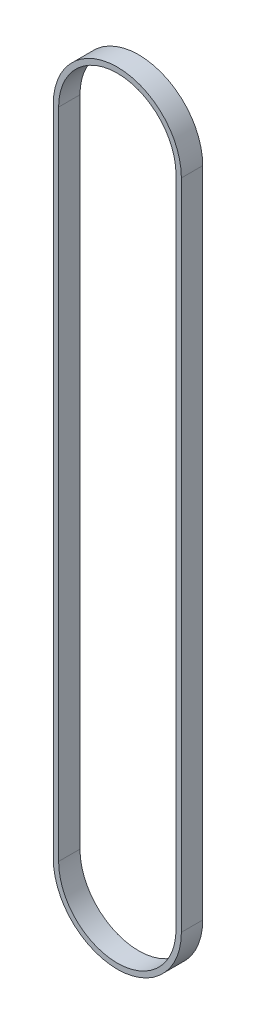
ISO-10303-21;
HEADER;
FILE_DESCRIPTION(('STEP AP214'),'2;1');
FILE_NAME('part.step','',(''),(''),'','','');
FILE_SCHEMA(('AUTOMOTIVE_DESIGN { 1 0 10303 214 1 1 1 1 }'));
ENDSEC;
DATA;
#1=APPLICATION_CONTEXT('core data for automotive mechanical design processes');
#2=APPLICATION_PROTOCOL_DEFINITION('international standard','automotive_design',2000,#1);
#3=PRODUCT_CONTEXT('',#1,'mechanical');
#4=PRODUCT('Part','Part','',(#3));
#5=PRODUCT_RELATED_PRODUCT_CATEGORY('part','',(#4));
#6=PRODUCT_DEFINITION_FORMATION('','',#4);
#7=PRODUCT_DEFINITION_CONTEXT('part definition',#1,'design');
#8=PRODUCT_DEFINITION('design','',#6,#7);
#9=PRODUCT_DEFINITION_SHAPE('','',#8);
#10=(LENGTH_UNIT() NAMED_UNIT(*) SI_UNIT(.MILLI.,.METRE.));
#11=(NAMED_UNIT(*) PLANE_ANGLE_UNIT() SI_UNIT($,.RADIAN.));
#12=(NAMED_UNIT(*) SI_UNIT($,.STERADIAN.) SOLID_ANGLE_UNIT());
#13=UNCERTAINTY_MEASURE_WITH_UNIT(LENGTH_MEASURE(1.E-05),#10,'distance_accuracy_value','');
#14=(GEOMETRIC_REPRESENTATION_CONTEXT(3) GLOBAL_UNCERTAINTY_ASSIGNED_CONTEXT((#13)) GLOBAL_UNIT_ASSIGNED_CONTEXT((#10,
#11,#12)) REPRESENTATION_CONTEXT('',''));
#15=CARTESIAN_POINT('',(0.,0.,0.));
#16=DIRECTION('',(0.,0.,1.));
#17=DIRECTION('',(1.,0.,0.));
#18=AXIS2_PLACEMENT_3D('',#15,#16,#17);
#19=CARTESIAN_POINT('',(0.,410.750708602889,25.4));
#20=DIRECTION('',(0.,0.,1.));
#21=DIRECTION('',(1.,0.,0.));
#22=AXIS2_PLACEMENT_3D('',#19,#20,#21);
#23=PLANE('',#22);
#24=CARTESIAN_POINT('',(0.,410.750708602889,25.4));
#25=DIRECTION('',(0.,0.,1.));
#26=DIRECTION('',(1.,0.,0.));
#27=AXIS2_PLACEMENT_3D('',#24,#25,#26);
#28=CIRCLE('',#27,76.2);
#29=CARTESIAN_POINT('',(76.2,410.750708602889,25.4));
#30=VERTEX_POINT('',#29);
#31=CARTESIAN_POINT('',(-76.2,410.750708602889,25.4));
#32=VERTEX_POINT('',#31);
#33=EDGE_CURVE('E139',#30,#32,#28,.T.);
#34=ORIENTED_EDGE('',*,*,#33,.T.);
#35=DIRECTION('',(0.,-1.,0.));
#36=VECTOR('',#35,1.);
#37=CARTESIAN_POINT('',(-76.2,-366.489291397111,25.4));
#38=LINE('',#37,#36);
#39=CARTESIAN_POINT('',(-76.2,-366.489291397111,25.4));
#40=VERTEX_POINT('',#39);
#41=EDGE_CURVE('E142',#32,#40,#38,.T.);
#42=ORIENTED_EDGE('',*,*,#41,.T.);
#43=CARTESIAN_POINT('',(0.,-366.489291397111,25.4));
#44=DIRECTION('',(0.,0.,1.));
#45=DIRECTION('',(1.,0.,0.));
#46=AXIS2_PLACEMENT_3D('',#43,#44,#45);
#47=CIRCLE('',#46,76.2);
#48=CARTESIAN_POINT('',(76.2,-366.489291397111,25.4));
#49=VERTEX_POINT('',#48);
#50=EDGE_CURVE('E145',#40,#49,#47,.T.);
#51=ORIENTED_EDGE('',*,*,#50,.T.);
#52=DIRECTION('',(0.,1.,0.));
#53=VECTOR('',#52,1.);
#54=CARTESIAN_POINT('',(76.2,-366.489291397111,25.4));
#55=LINE('',#54,#53);
#56=EDGE_CURVE('E147',#49,#30,#55,.T.);
#57=ORIENTED_EDGE('',*,*,#56,.T.);
#58=EDGE_LOOP('',(#34,#42,#51,#57));
#59=FACE_BOUND('',#58,.T.);
#60=DIRECTION('',(0.,-1.,0.));
#61=VECTOR('',#60,1.);
#62=CARTESIAN_POINT('',(-69.85,410.750708602889,25.4));
#63=LINE('',#62,#61);
#64=CARTESIAN_POINT('',(-69.85,410.750708602889,25.4));
#65=VERTEX_POINT('',#64);
#66=CARTESIAN_POINT('',(-69.85,-366.489291397111,25.4));
#67=VERTEX_POINT('',#66);
#68=EDGE_CURVE('E111',#65,#67,#63,.T.);
#69=ORIENTED_EDGE('',*,*,#68,.F.);
#70=CARTESIAN_POINT('',(0.,410.750708602889,25.4));
#71=DIRECTION('',(0.,0.,1.));
#72=DIRECTION('',(1.,0.,0.));
#73=AXIS2_PLACEMENT_3D('',#70,#71,#72);
#74=CIRCLE('',#73,69.85);
#75=CARTESIAN_POINT('',(69.85,410.750708602889,25.4));
#76=VERTEX_POINT('',#75);
#77=EDGE_CURVE('E103',#76,#65,#74,.T.);
#78=ORIENTED_EDGE('',*,*,#77,.F.);
#79=DIRECTION('',(0.,1.,0.));
#80=VECTOR('',#79,1.);
#81=CARTESIAN_POINT('',(69.85,-366.489291397111,25.4));
#82=LINE('',#81,#80);
#83=CARTESIAN_POINT('',(69.85,-366.489291397111,25.4));
#84=VERTEX_POINT('',#83);
#85=EDGE_CURVE('E125',#84,#76,#82,.T.);
#86=ORIENTED_EDGE('',*,*,#85,.F.);
#87=CARTESIAN_POINT('',(0.,-366.489291397111,25.4));
#88=DIRECTION('',(0.,0.,1.));
#89=DIRECTION('',(-1.,0.,0.));
#90=AXIS2_PLACEMENT_3D('',#87,#88,#89);
#91=CIRCLE('',#90,69.85);
#92=EDGE_CURVE('E123',#67,#84,#91,.T.);
#93=ORIENTED_EDGE('',*,*,#92,.F.);
#94=EDGE_LOOP('',(#69,#78,#86,#93));
#95=FACE_BOUND('',#94,.T.);
#96=ADVANCED_FACE('F38',(#59,#95),#23,.T.);
#97=CARTESIAN_POINT('',(0.,410.750708602889,0.));
#98=DIRECTION('',(0.,0.,1.));
#99=DIRECTION('',(1.,0.,0.));
#100=AXIS2_PLACEMENT_3D('',#97,#98,#99);
#101=PLANE('',#100);
#102=CARTESIAN_POINT('',(0.,410.750708602889,0.));
#103=DIRECTION('',(0.,0.,1.));
#104=DIRECTION('',(1.,0.,0.));
#105=AXIS2_PLACEMENT_3D('',#102,#103,#104);
#106=CIRCLE('',#105,76.2);
#107=CARTESIAN_POINT('',(76.2,410.750708602889,0.));
#108=VERTEX_POINT('',#107);
#109=CARTESIAN_POINT('',(-76.2,410.750708602889,0.));
#110=VERTEX_POINT('',#109);
#111=EDGE_CURVE('E119',#108,#110,#106,.T.);
#112=ORIENTED_EDGE('',*,*,#111,.F.);
#113=DIRECTION('',(0.,1.,0.));
#114=VECTOR('',#113,1.);
#115=CARTESIAN_POINT('',(76.2,-366.489291397111,0.));
#116=LINE('',#115,#114);
#117=CARTESIAN_POINT('',(76.2,-366.489291397111,0.));
#118=VERTEX_POINT('',#117);
#119=EDGE_CURVE('E143',#118,#108,#116,.T.);
#120=ORIENTED_EDGE('',*,*,#119,.F.);
#121=CARTESIAN_POINT('',(0.,-366.489291397111,0.));
#122=DIRECTION('',(0.,0.,1.));
#123=DIRECTION('',(1.,0.,0.));
#124=AXIS2_PLACEMENT_3D('',#121,#122,#123);
#125=CIRCLE('',#124,76.2);
#126=CARTESIAN_POINT('',(-76.2,-366.489291397111,0.));
#127=VERTEX_POINT('',#126);
#128=EDGE_CURVE('E154',#127,#118,#125,.T.);
#129=ORIENTED_EDGE('',*,*,#128,.F.);
#130=DIRECTION('',(0.,-1.,0.));
#131=VECTOR('',#130,1.);
#132=CARTESIAN_POINT('',(-76.2,-366.489291397111,0.));
#133=LINE('',#132,#131);
#134=EDGE_CURVE('E152',#110,#127,#133,.T.);
#135=ORIENTED_EDGE('',*,*,#134,.F.);
#136=EDGE_LOOP('',(#112,#120,#129,#135));
#137=FACE_BOUND('',#136,.T.);
#138=CARTESIAN_POINT('',(0.,410.750708602889,0.));
#139=DIRECTION('',(0.,0.,1.));
#140=DIRECTION('',(1.,0.,0.));
#141=AXIS2_PLACEMENT_3D('',#138,#139,#140);
#142=CIRCLE('',#141,69.85);
#143=CARTESIAN_POINT('',(69.85,410.750708602889,0.));
#144=VERTEX_POINT('',#143);
#145=CARTESIAN_POINT('',(-69.85,410.750708602889,0.));
#146=VERTEX_POINT('',#145);
#147=EDGE_CURVE('E61',#144,#146,#142,.T.);
#148=ORIENTED_EDGE('',*,*,#147,.T.);
#149=DIRECTION('',(0.,-1.,0.));
#150=VECTOR('',#149,1.);
#151=CARTESIAN_POINT('',(-69.85,410.750708602889,0.));
#152=LINE('',#151,#150);
#153=CARTESIAN_POINT('',(-69.85,-366.489291397111,0.));
#154=VERTEX_POINT('',#153);
#155=EDGE_CURVE('E118',#146,#154,#152,.T.);
#156=ORIENTED_EDGE('',*,*,#155,.T.);
#157=CARTESIAN_POINT('',(0.,-366.489291397111,0.));
#158=DIRECTION('',(0.,0.,1.));
#159=DIRECTION('',(-1.,0.,0.));
#160=AXIS2_PLACEMENT_3D('',#157,#158,#159);
#161=CIRCLE('',#160,69.85);
#162=CARTESIAN_POINT('',(69.85,-366.489291397111,0.));
#163=VERTEX_POINT('',#162);
#164=EDGE_CURVE('E131',#154,#163,#161,.T.);
#165=ORIENTED_EDGE('',*,*,#164,.T.);
#166=DIRECTION('',(0.,1.,0.));
#167=VECTOR('',#166,1.);
#168=CARTESIAN_POINT('',(69.85,-366.489291397111,0.));
#169=LINE('',#168,#167);
#170=EDGE_CURVE('E112',#163,#144,#169,.T.);
#171=ORIENTED_EDGE('',*,*,#170,.T.);
#172=EDGE_LOOP('',(#148,#156,#165,#171));
#173=FACE_BOUND('',#172,.T.);
#174=ADVANCED_FACE('F172',(#137,#173),#101,.F.);
#175=CARTESIAN_POINT('',(0.,410.750708602889,25.4));
#176=DIRECTION('',(0.,0.,-1.));
#177=DIRECTION('',(-1.,0.,0.));
#178=AXIS2_PLACEMENT_3D('',#175,#176,#177);
#179=CYLINDRICAL_SURFACE('',#178,76.2);
#180=ORIENTED_EDGE('',*,*,#111,.T.);
#181=DIRECTION('',(0.,0.,-1.));
#182=VECTOR('',#181,1.);
#183=CARTESIAN_POINT('',(-76.2,410.750708602889,25.4));
#184=LINE('',#183,#182);
#185=EDGE_CURVE('E11',#32,#110,#184,.T.);
#186=ORIENTED_EDGE('',*,*,#185,.F.);
#187=ORIENTED_EDGE('',*,*,#33,.F.);
#188=DIRECTION('',(0.,0.,-1.));
#189=VECTOR('',#188,1.);
#190=CARTESIAN_POINT('',(76.2,410.750708602889,25.4));
#191=LINE('',#190,#189);
#192=EDGE_CURVE('E149',#30,#108,#191,.T.);
#193=ORIENTED_EDGE('',*,*,#192,.T.);
#194=EDGE_LOOP('',(#180,#186,#187,#193));
#195=FACE_BOUND('',#194,.T.);
#196=ADVANCED_FACE('F40',(#195),#179,.T.);
#197=CARTESIAN_POINT('',(-76.2,-366.489291397111,25.4));
#198=DIRECTION('',(1.,0.,0.));
#199=DIRECTION('',(0.,0.,-1.));
#200=AXIS2_PLACEMENT_3D('',#197,#198,#199);
#201=PLANE('',#200);
#202=ORIENTED_EDGE('',*,*,#134,.T.);
#203=DIRECTION('',(0.,0.,-1.));
#204=VECTOR('',#203,1.);
#205=CARTESIAN_POINT('',(-76.2,-366.489291397111,25.4));
#206=LINE('',#205,#204);
#207=EDGE_CURVE('E46',#40,#127,#206,.T.);
#208=ORIENTED_EDGE('',*,*,#207,.F.);
#209=ORIENTED_EDGE('',*,*,#41,.F.);
#210=ORIENTED_EDGE('',*,*,#185,.T.);
#211=EDGE_LOOP('',(#202,#208,#209,#210));
#212=FACE_BOUND('',#211,.T.);
#213=ADVANCED_FACE('F182',(#212),#201,.F.);
#214=CARTESIAN_POINT('',(0.,-366.489291397111,25.4));
#215=DIRECTION('',(0.,0.,-1.));
#216=DIRECTION('',(-1.,0.,0.));
#217=AXIS2_PLACEMENT_3D('',#214,#215,#216);
#218=CYLINDRICAL_SURFACE('',#217,76.2);
#219=ORIENTED_EDGE('',*,*,#128,.T.);
#220=DIRECTION('',(0.,0.,-1.));
#221=VECTOR('',#220,1.);
#222=CARTESIAN_POINT('',(76.2,-366.489291397111,25.4));
#223=LINE('',#222,#221);
#224=EDGE_CURVE('E159',#49,#118,#223,.T.);
#225=ORIENTED_EDGE('',*,*,#224,.F.);
#226=ORIENTED_EDGE('',*,*,#50,.F.);
#227=ORIENTED_EDGE('',*,*,#207,.T.);
#228=EDGE_LOOP('',(#219,#225,#226,#227));
#229=FACE_BOUND('',#228,.T.);
#230=ADVANCED_FACE('F166',(#229),#218,.T.);
#231=CARTESIAN_POINT('',(76.2,-366.489291397111,25.4));
#232=DIRECTION('',(-1.,0.,0.));
#233=DIRECTION('',(0.,-1.,0.));
#234=AXIS2_PLACEMENT_3D('',#231,#232,#233);
#235=PLANE('',#234);
#236=ORIENTED_EDGE('',*,*,#119,.T.);
#237=ORIENTED_EDGE('',*,*,#192,.F.);
#238=ORIENTED_EDGE('',*,*,#56,.F.);
#239=ORIENTED_EDGE('',*,*,#224,.T.);
#240=EDGE_LOOP('',(#236,#237,#238,#239));
#241=FACE_BOUND('',#240,.T.);
#242=ADVANCED_FACE('F176',(#241),#235,.F.);
#243=CARTESIAN_POINT('',(0.,410.750708602889,25.4));
#244=DIRECTION('',(0.,0.,-1.));
#245=DIRECTION('',(-1.,0.,0.));
#246=AXIS2_PLACEMENT_3D('',#243,#244,#245);
#247=CYLINDRICAL_SURFACE('',#246,69.85);
#248=ORIENTED_EDGE('',*,*,#147,.F.);
#249=DIRECTION('',(0.,0.,-1.));
#250=VECTOR('',#249,1.);
#251=CARTESIAN_POINT('',(69.85,410.750708602889,25.4));
#252=LINE('',#251,#250);
#253=EDGE_CURVE('E107',#76,#144,#252,.T.);
#254=ORIENTED_EDGE('',*,*,#253,.F.);
#255=ORIENTED_EDGE('',*,*,#77,.T.);
#256=DIRECTION('',(0.,0.,-1.));
#257=VECTOR('',#256,1.);
#258=CARTESIAN_POINT('',(-69.85,410.750708602889,25.4));
#259=LINE('',#258,#257);
#260=EDGE_CURVE('E106',#65,#146,#259,.T.);
#261=ORIENTED_EDGE('',*,*,#260,.T.);
#262=EDGE_LOOP('',(#248,#254,#255,#261));
#263=FACE_BOUND('',#262,.T.);
#264=ADVANCED_FACE('F105',(#263),#247,.F.);
#265=CARTESIAN_POINT('',(-69.85,410.750708602889,25.4));
#266=DIRECTION('',(1.,0.,0.));
#267=DIRECTION('',(0.,0.,-1.));
#268=AXIS2_PLACEMENT_3D('',#265,#266,#267);
#269=PLANE('',#268);
#270=ORIENTED_EDGE('',*,*,#155,.F.);
#271=ORIENTED_EDGE('',*,*,#260,.F.);
#272=ORIENTED_EDGE('',*,*,#68,.T.);
#273=DIRECTION('',(0.,0.,-1.));
#274=VECTOR('',#273,1.);
#275=CARTESIAN_POINT('',(-69.85,-366.489291397111,25.4));
#276=LINE('',#275,#274);
#277=EDGE_CURVE('E120',#67,#154,#276,.T.);
#278=ORIENTED_EDGE('',*,*,#277,.T.);
#279=EDGE_LOOP('',(#270,#271,#272,#278));
#280=FACE_BOUND('',#279,.T.);
#281=ADVANCED_FACE('F115',(#280),#269,.T.);
#282=CARTESIAN_POINT('',(0.,-366.489291397111,25.4));
#283=DIRECTION('',(0.,0.,-1.));
#284=DIRECTION('',(-1.,0.,0.));
#285=AXIS2_PLACEMENT_3D('',#282,#283,#284);
#286=CYLINDRICAL_SURFACE('',#285,69.85);
#287=ORIENTED_EDGE('',*,*,#164,.F.);
#288=ORIENTED_EDGE('',*,*,#277,.F.);
#289=ORIENTED_EDGE('',*,*,#92,.T.);
#290=DIRECTION('',(0.,0.,-1.));
#291=VECTOR('',#290,1.);
#292=CARTESIAN_POINT('',(69.85,-366.489291397111,25.4));
#293=LINE('',#292,#291);
#294=EDGE_CURVE('E53',#84,#163,#293,.T.);
#295=ORIENTED_EDGE('',*,*,#294,.T.);
#296=EDGE_LOOP('',(#287,#288,#289,#295));
#297=FACE_BOUND('',#296,.T.);
#298=ADVANCED_FACE('F205',(#297),#286,.F.);
#299=CARTESIAN_POINT('',(69.85,-366.489291397111,25.4));
#300=DIRECTION('',(-1.,0.,0.));
#301=DIRECTION('',(0.,0.,1.));
#302=AXIS2_PLACEMENT_3D('',#299,#300,#301);
#303=PLANE('',#302);
#304=ORIENTED_EDGE('',*,*,#170,.F.);
#305=ORIENTED_EDGE('',*,*,#294,.F.);
#306=ORIENTED_EDGE('',*,*,#85,.T.);
#307=ORIENTED_EDGE('',*,*,#253,.T.);
#308=EDGE_LOOP('',(#304,#305,#306,#307));
#309=FACE_BOUND('',#308,.T.);
#310=ADVANCED_FACE('F209',(#309),#303,.T.);
#311=CLOSED_SHELL('',(#96,#174,#196,#213,#230,#242,#264,#281,#298,#310));
#312=MANIFOLD_SOLID_BREP('B2',#311);
#313=ADVANCED_BREP_SHAPE_REPRESENTATION('',(#18,#312),#14);
#314=SHAPE_DEFINITION_REPRESENTATION(#9,#313);
ENDSEC;
END-ISO-10303-21;
